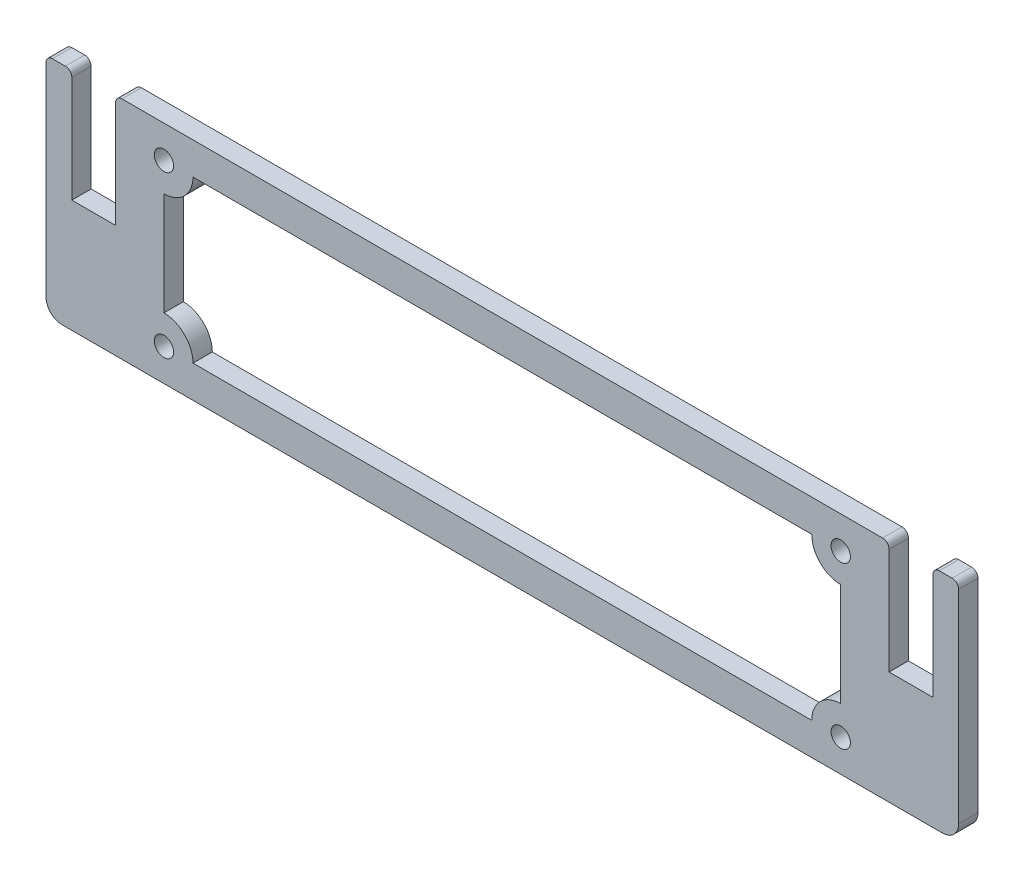
ISO-10303-21;
HEADER;
FILE_DESCRIPTION(('STEP AP214'),'2;1');
FILE_NAME('part.step','',(''),(''),'','','');
FILE_SCHEMA(('AUTOMOTIVE_DESIGN { 1 0 10303 214 1 1 1 1 }'));
ENDSEC;
DATA;
#1=APPLICATION_CONTEXT('core data for automotive mechanical design processes');
#2=APPLICATION_PROTOCOL_DEFINITION('international standard','automotive_design',2000,#1);
#3=PRODUCT_CONTEXT('',#1,'mechanical');
#4=PRODUCT('Part','Part','',(#3));
#5=PRODUCT_RELATED_PRODUCT_CATEGORY('part','',(#4));
#6=PRODUCT_DEFINITION_FORMATION('','',#4);
#7=PRODUCT_DEFINITION_CONTEXT('part definition',#1,'design');
#8=PRODUCT_DEFINITION('design','',#6,#7);
#9=PRODUCT_DEFINITION_SHAPE('','',#8);
#10=(LENGTH_UNIT() NAMED_UNIT(*) SI_UNIT(.MILLI.,.METRE.));
#11=(NAMED_UNIT(*) PLANE_ANGLE_UNIT() SI_UNIT($,.RADIAN.));
#12=(NAMED_UNIT(*) SI_UNIT($,.STERADIAN.) SOLID_ANGLE_UNIT());
#13=UNCERTAINTY_MEASURE_WITH_UNIT(LENGTH_MEASURE(1.E-05),#10,'distance_accuracy_value','');
#14=(GEOMETRIC_REPRESENTATION_CONTEXT(3) GLOBAL_UNCERTAINTY_ASSIGNED_CONTEXT((#13)) GLOBAL_UNIT_ASSIGNED_CONTEXT((#10,
#11,#12)) REPRESENTATION_CONTEXT('',''));
#15=CARTESIAN_POINT('',(0.,0.,0.));
#16=DIRECTION('',(0.,0.,1.));
#17=DIRECTION('',(1.,0.,0.));
#18=AXIS2_PLACEMENT_3D('',#15,#16,#17);
#19=CARTESIAN_POINT('',(0.,-17.5,3.));
#20=DIRECTION('',(0.,-1.,0.));
#21=DIRECTION('',(0.,0.,-1.));
#22=AXIS2_PLACEMENT_3D('',#19,#20,#21);
#23=PLANE('',#22);
#24=DIRECTION('',(-1.,0.,0.));
#25=VECTOR('',#24,1.);
#26=CARTESIAN_POINT('',(0.,-17.5,0.));
#27=LINE('',#26,#25);
#28=CARTESIAN_POINT('',(68.3,-17.5,0.));
#29=VERTEX_POINT('',#28);
#30=CARTESIAN_POINT('',(-68.3,-17.5,0.));
#31=VERTEX_POINT('',#30);
#32=EDGE_CURVE('E338',#29,#31,#27,.T.);
#33=ORIENTED_EDGE('',*,*,#32,.F.);
#34=DIRECTION('',(0.,0.,-1.));
#35=VECTOR('',#34,1.);
#36=CARTESIAN_POINT('',(68.3,-17.5,3.));
#37=LINE('',#36,#35);
#38=CARTESIAN_POINT('',(68.3,-17.5,3.));
#39=VERTEX_POINT('',#38);
#40=EDGE_CURVE('E409',#29,#39,#37,.F.);
#41=ORIENTED_EDGE('',*,*,#40,.T.);
#42=DIRECTION('',(-1.,0.,0.));
#43=VECTOR('',#42,1.);
#44=CARTESIAN_POINT('',(0.,-17.5,3.));
#45=LINE('',#44,#43);
#46=CARTESIAN_POINT('',(-68.3,-17.5,3.));
#47=VERTEX_POINT('',#46);
#48=EDGE_CURVE('E270',#39,#47,#45,.T.);
#49=ORIENTED_EDGE('',*,*,#48,.T.);
#50=DIRECTION('',(0.,0.,-1.));
#51=VECTOR('',#50,1.);
#52=CARTESIAN_POINT('',(-68.3,-17.5,3.));
#53=LINE('',#52,#51);
#54=EDGE_CURVE('E406',#47,#31,#53,.T.);
#55=ORIENTED_EDGE('',*,*,#54,.T.);
#56=EDGE_LOOP('',(#33,#41,#49,#55));
#57=FACE_BOUND('',#56,.T.);
#58=ADVANCED_FACE('F37',(#57),#23,.T.);
#59=CARTESIAN_POINT('',(70.8,0.,3.));
#60=DIRECTION('',(-1.,0.,0.));
#61=DIRECTION('',(0.,0.,1.));
#62=AXIS2_PLACEMENT_3D('',#59,#60,#61);
#63=PLANE('',#62);
#64=DIRECTION('',(0.,1.,0.));
#65=VECTOR('',#64,1.);
#66=CARTESIAN_POINT('',(70.8,0.,0.));
#67=LINE('',#66,#65);
#68=CARTESIAN_POINT('',(70.8,-15.,0.));
#69=VERTEX_POINT('',#68);
#70=CARTESIAN_POINT('',(70.8,16.5,0.));
#71=VERTEX_POINT('',#70);
#72=EDGE_CURVE('E341',#69,#71,#67,.T.);
#73=ORIENTED_EDGE('',*,*,#72,.T.);
#74=DIRECTION('',(0.,0.,-1.));
#75=VECTOR('',#74,1.);
#76=CARTESIAN_POINT('',(70.8,16.5,3.));
#77=LINE('',#76,#75);
#78=CARTESIAN_POINT('',(70.8,16.5,3.));
#79=VERTEX_POINT('',#78);
#80=EDGE_CURVE('E434',#71,#79,#77,.F.);
#81=ORIENTED_EDGE('',*,*,#80,.T.);
#82=DIRECTION('',(0.,1.,0.));
#83=VECTOR('',#82,1.);
#84=CARTESIAN_POINT('',(70.8,0.,3.));
#85=LINE('',#84,#83);
#86=CARTESIAN_POINT('',(70.8,-15.,3.));
#87=VERTEX_POINT('',#86);
#88=EDGE_CURVE('E273',#87,#79,#85,.T.);
#89=ORIENTED_EDGE('',*,*,#88,.F.);
#90=DIRECTION('',(0.,0.,-1.));
#91=VECTOR('',#90,1.);
#92=CARTESIAN_POINT('',(70.8,-15.,0.));
#93=LINE('',#92,#91);
#94=EDGE_CURVE('E385',#87,#69,#93,.T.);
#95=ORIENTED_EDGE('',*,*,#94,.T.);
#96=EDGE_LOOP('',(#73,#81,#89,#95));
#97=FACE_BOUND('',#96,.T.);
#98=ADVANCED_FACE('F501',(#97),#63,.F.);
#99=CARTESIAN_POINT('',(0.,17.5,3.));
#100=DIRECTION('',(0.,1.,0.));
#101=DIRECTION('',(0.,0.,1.));
#102=AXIS2_PLACEMENT_3D('',#99,#100,#101);
#103=PLANE('',#102);
#104=DIRECTION('',(1.,0.,0.));
#105=VECTOR('',#104,1.);
#106=CARTESIAN_POINT('',(0.,17.5,3.));
#107=LINE('',#106,#105);
#108=CARTESIAN_POINT('',(67.8,17.5,3.));
#109=VERTEX_POINT('',#108);
#110=CARTESIAN_POINT('',(69.8,17.5,3.));
#111=VERTEX_POINT('',#110);
#112=EDGE_CURVE('E276',#109,#111,#107,.T.);
#113=ORIENTED_EDGE('',*,*,#112,.T.);
#114=DIRECTION('',(0.,0.,-1.));
#115=VECTOR('',#114,1.);
#116=CARTESIAN_POINT('',(69.8,17.5,0.));
#117=LINE('',#116,#115);
#118=CARTESIAN_POINT('',(69.8,17.5,0.));
#119=VERTEX_POINT('',#118);
#120=EDGE_CURVE('E419',#111,#119,#117,.T.);
#121=ORIENTED_EDGE('',*,*,#120,.T.);
#122=DIRECTION('',(1.,0.,0.));
#123=VECTOR('',#122,1.);
#124=CARTESIAN_POINT('',(0.,17.5,0.));
#125=LINE('',#124,#123);
#126=CARTESIAN_POINT('',(67.8,17.5,0.));
#127=VERTEX_POINT('',#126);
#128=EDGE_CURVE('E344',#127,#119,#125,.T.);
#129=ORIENTED_EDGE('',*,*,#128,.F.);
#130=DIRECTION('',(0.,0.,-1.));
#131=VECTOR('',#130,1.);
#132=CARTESIAN_POINT('',(67.8,17.5,3.));
#133=LINE('',#132,#131);
#134=EDGE_CURVE('E417',#127,#109,#133,.F.);
#135=ORIENTED_EDGE('',*,*,#134,.T.);
#136=EDGE_LOOP('',(#113,#121,#129,#135));
#137=FACE_BOUND('',#136,.T.);
#138=ADVANCED_FACE('F510',(#137),#103,.T.);
#139=CARTESIAN_POINT('',(66.8,0.,3.));
#140=DIRECTION('',(-1.,0.,0.));
#141=DIRECTION('',(0.,0.,1.));
#142=AXIS2_PLACEMENT_3D('',#139,#140,#141);
#143=PLANE('',#142);
#144=DIRECTION('',(0.,1.,0.));
#145=VECTOR('',#144,1.);
#146=CARTESIAN_POINT('',(66.8,0.,3.));
#147=LINE('',#146,#145);
#148=CARTESIAN_POINT('',(66.8,0.,3.));
#149=VERTEX_POINT('',#148);
#150=CARTESIAN_POINT('',(66.8,16.5,3.));
#151=VERTEX_POINT('',#150);
#152=EDGE_CURVE('E279',#149,#151,#147,.T.);
#153=ORIENTED_EDGE('',*,*,#152,.T.);
#154=DIRECTION('',(0.,0.,-1.));
#155=VECTOR('',#154,1.);
#156=CARTESIAN_POINT('',(66.8,16.5,3.));
#157=LINE('',#156,#155);
#158=CARTESIAN_POINT('',(66.8,16.5,0.));
#159=VERTEX_POINT('',#158);
#160=EDGE_CURVE('E447',#151,#159,#157,.T.);
#161=ORIENTED_EDGE('',*,*,#160,.T.);
#162=DIRECTION('',(0.,1.,0.));
#163=VECTOR('',#162,1.);
#164=CARTESIAN_POINT('',(66.8,0.,0.));
#165=LINE('',#164,#163);
#166=CARTESIAN_POINT('',(66.8,0.,0.));
#167=VERTEX_POINT('',#166);
#168=EDGE_CURVE('E347',#167,#159,#165,.T.);
#169=ORIENTED_EDGE('',*,*,#168,.F.);
#170=DIRECTION('',(0.,0.,-1.));
#171=VECTOR('',#170,1.);
#172=CARTESIAN_POINT('',(66.8,0.,3.));
#173=LINE('',#172,#171);
#174=EDGE_CURVE('E383',#149,#167,#173,.T.);
#175=ORIENTED_EDGE('',*,*,#174,.F.);
#176=EDGE_LOOP('',(#153,#161,#169,#175));
#177=FACE_BOUND('',#176,.T.);
#178=ADVANCED_FACE('F518',(#177),#143,.T.);
#179=CARTESIAN_POINT('',(0.,0.,3.));
#180=DIRECTION('',(0.,1.,0.));
#181=DIRECTION('',(-1.,0.,0.));
#182=AXIS2_PLACEMENT_3D('',#179,#180,#181);
#183=PLANE('',#182);
#184=DIRECTION('',(1.,0.,0.));
#185=VECTOR('',#184,1.);
#186=CARTESIAN_POINT('',(0.,0.,0.));
#187=LINE('',#186,#185);
#188=CARTESIAN_POINT('',(60.,0.,0.));
#189=VERTEX_POINT('',#188);
#190=EDGE_CURVE('E350',#189,#167,#187,.T.);
#191=ORIENTED_EDGE('',*,*,#190,.F.);
#192=DIRECTION('',(0.,0.,-1.));
#193=VECTOR('',#192,1.);
#194=CARTESIAN_POINT('',(60.,0.,3.));
#195=LINE('',#194,#193);
#196=CARTESIAN_POINT('',(60.,0.,3.));
#197=VERTEX_POINT('',#196);
#198=EDGE_CURVE('E381',#197,#189,#195,.T.);
#199=ORIENTED_EDGE('',*,*,#198,.F.);
#200=DIRECTION('',(1.,0.,0.));
#201=VECTOR('',#200,1.);
#202=CARTESIAN_POINT('',(0.,0.,3.));
#203=LINE('',#202,#201);
#204=EDGE_CURVE('E282',#197,#149,#203,.T.);
#205=ORIENTED_EDGE('',*,*,#204,.T.);
#206=ORIENTED_EDGE('',*,*,#174,.T.);
#207=EDGE_LOOP('',(#191,#199,#205,#206));
#208=FACE_BOUND('',#207,.T.);
#209=ADVANCED_FACE('F523',(#208),#183,.T.);
#210=CARTESIAN_POINT('',(60.,0.,3.));
#211=DIRECTION('',(-1.,0.,0.));
#212=DIRECTION('',(0.,-1.,0.));
#213=AXIS2_PLACEMENT_3D('',#210,#211,#212);
#214=PLANE('',#213);
#215=DIRECTION('',(0.,1.,0.));
#216=VECTOR('',#215,1.);
#217=CARTESIAN_POINT('',(60.,0.,0.));
#218=LINE('',#217,#216);
#219=CARTESIAN_POINT('',(60.,16.5,0.));
#220=VERTEX_POINT('',#219);
#221=EDGE_CURVE('E353',#189,#220,#218,.T.);
#222=ORIENTED_EDGE('',*,*,#221,.T.);
#223=DIRECTION('',(0.,0.,-1.));
#224=VECTOR('',#223,1.);
#225=CARTESIAN_POINT('',(60.,16.5,3.));
#226=LINE('',#225,#224);
#227=CARTESIAN_POINT('',(60.,16.5,3.));
#228=VERTEX_POINT('',#227);
#229=EDGE_CURVE('E455',#220,#228,#226,.F.);
#230=ORIENTED_EDGE('',*,*,#229,.T.);
#231=DIRECTION('',(0.,1.,0.));
#232=VECTOR('',#231,1.);
#233=CARTESIAN_POINT('',(60.,0.,3.));
#234=LINE('',#233,#232);
#235=EDGE_CURVE('E285',#197,#228,#234,.T.);
#236=ORIENTED_EDGE('',*,*,#235,.F.);
#237=ORIENTED_EDGE('',*,*,#198,.T.);
#238=EDGE_LOOP('',(#222,#230,#236,#237));
#239=FACE_BOUND('',#238,.T.);
#240=ADVANCED_FACE('F527',(#239),#214,.F.);
#241=CARTESIAN_POINT('',(0.,17.5,3.));
#242=DIRECTION('',(0.,1.,0.));
#243=DIRECTION('',(-1.,0.,0.));
#244=AXIS2_PLACEMENT_3D('',#241,#242,#243);
#245=PLANE('',#244);
#246=DIRECTION('',(1.,0.,0.));
#247=VECTOR('',#246,1.);
#248=CARTESIAN_POINT('',(0.,17.5,3.));
#249=LINE('',#248,#247);
#250=CARTESIAN_POINT('',(-59.,17.5,3.));
#251=VERTEX_POINT('',#250);
#252=CARTESIAN_POINT('',(59.,17.5,3.));
#253=VERTEX_POINT('',#252);
#254=EDGE_CURVE('E288',#251,#253,#249,.T.);
#255=ORIENTED_EDGE('',*,*,#254,.T.);
#256=DIRECTION('',(0.,0.,-1.));
#257=VECTOR('',#256,1.);
#258=CARTESIAN_POINT('',(59.,17.5,0.));
#259=LINE('',#258,#257);
#260=CARTESIAN_POINT('',(59.,17.5,0.));
#261=VERTEX_POINT('',#260);
#262=EDGE_CURVE('E452',#253,#261,#259,.T.);
#263=ORIENTED_EDGE('',*,*,#262,.T.);
#264=DIRECTION('',(1.,0.,0.));
#265=VECTOR('',#264,1.);
#266=CARTESIAN_POINT('',(0.,17.5,0.));
#267=LINE('',#266,#265);
#268=CARTESIAN_POINT('',(-59.,17.5,0.));
#269=VERTEX_POINT('',#268);
#270=EDGE_CURVE('E356',#269,#261,#267,.T.);
#271=ORIENTED_EDGE('',*,*,#270,.F.);
#272=DIRECTION('',(0.,0.,-1.));
#273=VECTOR('',#272,1.);
#274=CARTESIAN_POINT('',(-59.,17.5,3.));
#275=LINE('',#274,#273);
#276=EDGE_CURVE('E450',#269,#251,#275,.F.);
#277=ORIENTED_EDGE('',*,*,#276,.T.);
#278=EDGE_LOOP('',(#255,#263,#271,#277));
#279=FACE_BOUND('',#278,.T.);
#280=ADVANCED_FACE('F536',(#279),#245,.T.);
#281=CARTESIAN_POINT('',(-60.,0.,3.));
#282=DIRECTION('',(-1.,0.,0.));
#283=DIRECTION('',(0.,0.,1.));
#284=AXIS2_PLACEMENT_3D('',#281,#282,#283);
#285=PLANE('',#284);
#286=DIRECTION('',(0.,1.,0.));
#287=VECTOR('',#286,1.);
#288=CARTESIAN_POINT('',(-60.,0.,3.));
#289=LINE('',#288,#287);
#290=CARTESIAN_POINT('',(-60.,0.,3.));
#291=VERTEX_POINT('',#290);
#292=CARTESIAN_POINT('',(-60.,16.5,3.));
#293=VERTEX_POINT('',#292);
#294=EDGE_CURVE('E291',#291,#293,#289,.T.);
#295=ORIENTED_EDGE('',*,*,#294,.T.);
#296=DIRECTION('',(0.,0.,-1.));
#297=VECTOR('',#296,1.);
#298=CARTESIAN_POINT('',(-60.,16.5,3.));
#299=LINE('',#298,#297);
#300=CARTESIAN_POINT('',(-60.,16.5,0.));
#301=VERTEX_POINT('',#300);
#302=EDGE_CURVE('E11',#293,#301,#299,.T.);
#303=ORIENTED_EDGE('',*,*,#302,.T.);
#304=DIRECTION('',(0.,1.,0.));
#305=VECTOR('',#304,1.);
#306=CARTESIAN_POINT('',(-60.,0.,0.));
#307=LINE('',#306,#305);
#308=CARTESIAN_POINT('',(-60.,0.,0.));
#309=VERTEX_POINT('',#308);
#310=EDGE_CURVE('E359',#309,#301,#307,.T.);
#311=ORIENTED_EDGE('',*,*,#310,.F.);
#312=DIRECTION('',(0.,0.,-1.));
#313=VECTOR('',#312,1.);
#314=CARTESIAN_POINT('',(-60.,0.,3.));
#315=LINE('',#314,#313);
#316=EDGE_CURVE('E379',#291,#309,#315,.T.);
#317=ORIENTED_EDGE('',*,*,#316,.F.);
#318=EDGE_LOOP('',(#295,#303,#311,#317));
#319=FACE_BOUND('',#318,.T.);
#320=ADVANCED_FACE('F544',(#319),#285,.T.);
#321=CARTESIAN_POINT('',(0.,0.,3.));
#322=DIRECTION('',(0.,-1.,0.));
#323=DIRECTION('',(1.,0.,0.));
#324=AXIS2_PLACEMENT_3D('',#321,#322,#323);
#325=PLANE('',#324);
#326=DIRECTION('',(-1.,0.,0.));
#327=VECTOR('',#326,1.);
#328=CARTESIAN_POINT('',(0.,0.,0.));
#329=LINE('',#328,#327);
#330=CARTESIAN_POINT('',(-66.8,0.,0.));
#331=VERTEX_POINT('',#330);
#332=EDGE_CURVE('E362',#309,#331,#329,.T.);
#333=ORIENTED_EDGE('',*,*,#332,.T.);
#334=DIRECTION('',(0.,0.,-1.));
#335=VECTOR('',#334,1.);
#336=CARTESIAN_POINT('',(-66.8,0.,3.));
#337=LINE('',#336,#335);
#338=CARTESIAN_POINT('',(-66.8,0.,3.));
#339=VERTEX_POINT('',#338);
#340=EDGE_CURVE('E235',#339,#331,#337,.T.);
#341=ORIENTED_EDGE('',*,*,#340,.F.);
#342=DIRECTION('',(-1.,0.,0.));
#343=VECTOR('',#342,1.);
#344=CARTESIAN_POINT('',(0.,0.,3.));
#345=LINE('',#344,#343);
#346=EDGE_CURVE('E294',#291,#339,#345,.T.);
#347=ORIENTED_EDGE('',*,*,#346,.F.);
#348=ORIENTED_EDGE('',*,*,#316,.T.);
#349=EDGE_LOOP('',(#333,#341,#347,#348));
#350=FACE_BOUND('',#349,.T.);
#351=ADVANCED_FACE('F546',(#350),#325,.F.);
#352=CARTESIAN_POINT('',(-66.8,0.,3.));
#353=DIRECTION('',(-1.,0.,0.));
#354=DIRECTION('',(0.,0.,1.));
#355=AXIS2_PLACEMENT_3D('',#352,#353,#354);
#356=PLANE('',#355);
#357=DIRECTION('',(0.,1.,0.));
#358=VECTOR('',#357,1.);
#359=CARTESIAN_POINT('',(-66.8,0.,0.));
#360=LINE('',#359,#358);
#361=CARTESIAN_POINT('',(-66.8,16.5,0.));
#362=VERTEX_POINT('',#361);
#363=EDGE_CURVE('E365',#331,#362,#360,.T.);
#364=ORIENTED_EDGE('',*,*,#363,.T.);
#365=DIRECTION('',(0.,0.,-1.));
#366=VECTOR('',#365,1.);
#367=CARTESIAN_POINT('',(-66.8,16.5,3.));
#368=LINE('',#367,#366);
#369=CARTESIAN_POINT('',(-66.8,16.5,3.));
#370=VERTEX_POINT('',#369);
#371=EDGE_CURVE('E45',#362,#370,#368,.F.);
#372=ORIENTED_EDGE('',*,*,#371,.T.);
#373=DIRECTION('',(0.,1.,0.));
#374=VECTOR('',#373,1.);
#375=CARTESIAN_POINT('',(-66.8,0.,3.));
#376=LINE('',#375,#374);
#377=EDGE_CURVE('E297',#339,#370,#376,.T.);
#378=ORIENTED_EDGE('',*,*,#377,.F.);
#379=ORIENTED_EDGE('',*,*,#340,.T.);
#380=EDGE_LOOP('',(#364,#372,#378,#379));
#381=FACE_BOUND('',#380,.T.);
#382=ADVANCED_FACE('F465',(#381),#356,.F.);
#383=CARTESIAN_POINT('',(0.,17.5,3.));
#384=DIRECTION('',(0.,-1.,0.));
#385=DIRECTION('',(0.,0.,-1.));
#386=AXIS2_PLACEMENT_3D('',#383,#384,#385);
#387=PLANE('',#386);
#388=DIRECTION('',(-1.,0.,0.));
#389=VECTOR('',#388,1.);
#390=CARTESIAN_POINT('',(0.,17.5,0.));
#391=LINE('',#390,#389);
#392=CARTESIAN_POINT('',(-67.8,17.5,0.));
#393=VERTEX_POINT('',#392);
#394=CARTESIAN_POINT('',(-69.8,17.5,0.));
#395=VERTEX_POINT('',#394);
#396=EDGE_CURVE('E368',#393,#395,#391,.T.);
#397=ORIENTED_EDGE('',*,*,#396,.T.);
#398=DIRECTION('',(0.,0.,-1.));
#399=VECTOR('',#398,1.);
#400=CARTESIAN_POINT('',(-69.8,17.5,3.));
#401=LINE('',#400,#399);
#402=CARTESIAN_POINT('',(-69.8,17.5,3.));
#403=VERTEX_POINT('',#402);
#404=EDGE_CURVE('E60',#395,#403,#401,.F.);
#405=ORIENTED_EDGE('',*,*,#404,.T.);
#406=DIRECTION('',(-1.,0.,0.));
#407=VECTOR('',#406,1.);
#408=CARTESIAN_POINT('',(0.,17.5,3.));
#409=LINE('',#408,#407);
#410=CARTESIAN_POINT('',(-67.8,17.5,3.));
#411=VERTEX_POINT('',#410);
#412=EDGE_CURVE('E300',#411,#403,#409,.T.);
#413=ORIENTED_EDGE('',*,*,#412,.F.);
#414=DIRECTION('',(0.,0.,-1.));
#415=VECTOR('',#414,1.);
#416=CARTESIAN_POINT('',(-67.8,17.5,3.));
#417=LINE('',#416,#415);
#418=EDGE_CURVE('E460',#411,#393,#417,.T.);
#419=ORIENTED_EDGE('',*,*,#418,.T.);
#420=EDGE_LOOP('',(#397,#405,#413,#419));
#421=FACE_BOUND('',#420,.T.);
#422=ADVANCED_FACE('F475',(#421),#387,.F.);
#423=CARTESIAN_POINT('',(52.5,0.,3.));
#424=DIRECTION('',(-1.,0.,0.));
#425=DIRECTION('',(0.,0.,1.));
#426=AXIS2_PLACEMENT_3D('',#423,#424,#425);
#427=PLANE('',#426);
#428=DIRECTION('',(0.,1.,0.));
#429=VECTOR('',#428,1.);
#430=CARTESIAN_POINT('',(52.5,0.,0.));
#431=LINE('',#430,#429);
#432=CARTESIAN_POINT('',(52.5,-8.,0.));
#433=VERTEX_POINT('',#432);
#434=CARTESIAN_POINT('',(52.5,8.,0.));
#435=VERTEX_POINT('',#434);
#436=EDGE_CURVE('E230',#433,#435,#431,.T.);
#437=ORIENTED_EDGE('',*,*,#436,.F.);
#438=DIRECTION('',(0.,0.,-1.));
#439=VECTOR('',#438,1.);
#440=CARTESIAN_POINT('',(52.5,-8.,3.));
#441=LINE('',#440,#439);
#442=CARTESIAN_POINT('',(52.5,-8.,3.));
#443=VERTEX_POINT('',#442);
#444=EDGE_CURVE('E225',#443,#433,#441,.T.);
#445=ORIENTED_EDGE('',*,*,#444,.F.);
#446=DIRECTION('',(0.,1.,0.));
#447=VECTOR('',#446,1.);
#448=CARTESIAN_POINT('',(52.5,0.,3.));
#449=LINE('',#448,#447);
#450=CARTESIAN_POINT('',(52.5,8.,3.));
#451=VERTEX_POINT('',#450);
#452=EDGE_CURVE('E228',#443,#451,#449,.T.);
#453=ORIENTED_EDGE('',*,*,#452,.T.);
#454=DIRECTION('',(0.,0.,-1.));
#455=VECTOR('',#454,1.);
#456=CARTESIAN_POINT('',(52.5,8.,3.));
#457=LINE('',#456,#455);
#458=EDGE_CURVE('E307',#451,#435,#457,.T.);
#459=ORIENTED_EDGE('',*,*,#458,.T.);
#460=EDGE_LOOP('',(#437,#445,#453,#459));
#461=FACE_BOUND('',#460,.T.);
#462=ADVANCED_FACE('F227',(#461),#427,.T.);
#463=CARTESIAN_POINT('',(52.5,-12.5,3.));
#464=DIRECTION('',(0.,0.,-1.));
#465=DIRECTION('',(-1.,0.,0.));
#466=AXIS2_PLACEMENT_3D('',#463,#464,#465);
#467=CYLINDRICAL_SURFACE('',#466,4.5);
#468=CARTESIAN_POINT('',(52.5,-12.5,0.));
#469=DIRECTION('',(0.,0.,1.));
#470=DIRECTION('',(1.,0.,0.));
#471=AXIS2_PLACEMENT_3D('',#468,#469,#470);
#472=CIRCLE('',#471,4.5);
#473=CARTESIAN_POINT('',(48.,-12.5,0.));
#474=VERTEX_POINT('',#473);
#475=EDGE_CURVE('E315',#474,#433,#472,.F.);
#476=ORIENTED_EDGE('',*,*,#475,.F.);
#477=DIRECTION('',(0.,0.,-1.));
#478=VECTOR('',#477,1.);
#479=CARTESIAN_POINT('',(48.,-12.5,3.));
#480=LINE('',#479,#478);
#481=CARTESIAN_POINT('',(48.,-12.5,3.));
#482=VERTEX_POINT('',#481);
#483=EDGE_CURVE('E236',#482,#474,#480,.T.);
#484=ORIENTED_EDGE('',*,*,#483,.F.);
#485=CARTESIAN_POINT('',(52.5,-12.5,3.));
#486=DIRECTION('',(0.,0.,1.));
#487=DIRECTION('',(1.,0.,0.));
#488=AXIS2_PLACEMENT_3D('',#485,#486,#487);
#489=CIRCLE('',#488,4.5);
#490=EDGE_CURVE('E243',#482,#443,#489,.F.);
#491=ORIENTED_EDGE('',*,*,#490,.T.);
#492=ORIENTED_EDGE('',*,*,#444,.T.);
#493=EDGE_LOOP('',(#476,#484,#491,#492));
#494=FACE_BOUND('',#493,.T.);
#495=ADVANCED_FACE('F250',(#494),#467,.T.);
#496=CARTESIAN_POINT('',(0.,-12.5,3.));
#497=DIRECTION('',(0.,1.,0.));
#498=DIRECTION('',(0.,0.,1.));
#499=AXIS2_PLACEMENT_3D('',#496,#497,#498);
#500=PLANE('',#499);
#501=DIRECTION('',(1.,0.,0.));
#502=VECTOR('',#501,1.);
#503=CARTESIAN_POINT('',(0.,-12.5,0.));
#504=LINE('',#503,#502);
#505=CARTESIAN_POINT('',(-48.,-12.5,0.));
#506=VERTEX_POINT('',#505);
#507=EDGE_CURVE('E317',#506,#474,#504,.T.);
#508=ORIENTED_EDGE('',*,*,#507,.F.);
#509=DIRECTION('',(0.,0.,-1.));
#510=VECTOR('',#509,1.);
#511=CARTESIAN_POINT('',(-48.,-12.5,3.));
#512=LINE('',#511,#510);
#513=CARTESIAN_POINT('',(-48.,-12.5,3.));
#514=VERTEX_POINT('',#513);
#515=EDGE_CURVE('E397',#514,#506,#512,.T.);
#516=ORIENTED_EDGE('',*,*,#515,.F.);
#517=DIRECTION('',(1.,0.,0.));
#518=VECTOR('',#517,1.);
#519=CARTESIAN_POINT('',(0.,-12.5,3.));
#520=LINE('',#519,#518);
#521=EDGE_CURVE('E251',#514,#482,#520,.T.);
#522=ORIENTED_EDGE('',*,*,#521,.T.);
#523=ORIENTED_EDGE('',*,*,#483,.T.);
#524=EDGE_LOOP('',(#508,#516,#522,#523));
#525=FACE_BOUND('',#524,.T.);
#526=ADVANCED_FACE('F587',(#525),#500,.T.);
#527=CARTESIAN_POINT('',(-52.5,-12.5,3.));
#528=DIRECTION('',(0.,0.,-1.));
#529=DIRECTION('',(-1.,0.,0.));
#530=AXIS2_PLACEMENT_3D('',#527,#528,#529);
#531=CYLINDRICAL_SURFACE('',#530,4.49999999999998);
#532=CARTESIAN_POINT('',(-52.5,-12.5,0.));
#533=DIRECTION('',(0.,0.,1.));
#534=DIRECTION('',(1.,0.,0.));
#535=AXIS2_PLACEMENT_3D('',#532,#533,#534);
#536=CIRCLE('',#535,4.49999999999998);
#537=CARTESIAN_POINT('',(-52.5,-8.00000000000002,0.));
#538=VERTEX_POINT('',#537);
#539=EDGE_CURVE('E320',#506,#538,#536,.T.);
#540=ORIENTED_EDGE('',*,*,#539,.T.);
#541=DIRECTION('',(0.,0.,-1.));
#542=VECTOR('',#541,1.);
#543=CARTESIAN_POINT('',(-52.5,-8.00000000000002,3.));
#544=LINE('',#543,#542);
#545=CARTESIAN_POINT('',(-52.5,-8.00000000000002,3.));
#546=VERTEX_POINT('',#545);
#547=EDGE_CURVE('E394',#546,#538,#544,.T.);
#548=ORIENTED_EDGE('',*,*,#547,.F.);
#549=CARTESIAN_POINT('',(-52.5,-12.5,3.));
#550=DIRECTION('',(0.,0.,1.));
#551=DIRECTION('',(1.,0.,0.));
#552=AXIS2_PLACEMENT_3D('',#549,#550,#551);
#553=CIRCLE('',#552,4.49999999999998);
#554=EDGE_CURVE('E253',#514,#546,#553,.T.);
#555=ORIENTED_EDGE('',*,*,#554,.F.);
#556=ORIENTED_EDGE('',*,*,#515,.T.);
#557=EDGE_LOOP('',(#540,#548,#555,#556));
#558=FACE_BOUND('',#557,.T.);
#559=ADVANCED_FACE('F583',(#558),#531,.T.);
#560=CARTESIAN_POINT('',(-52.5,0.,3.));
#561=DIRECTION('',(-1.,0.,0.));
#562=DIRECTION('',(0.,0.,1.));
#563=AXIS2_PLACEMENT_3D('',#560,#561,#562);
#564=PLANE('',#563);
#565=DIRECTION('',(0.,1.,0.));
#566=VECTOR('',#565,1.);
#567=CARTESIAN_POINT('',(-52.5,0.,0.));
#568=LINE('',#567,#566);
#569=CARTESIAN_POINT('',(-52.5,8.,0.));
#570=VERTEX_POINT('',#569);
#571=EDGE_CURVE('E323',#538,#570,#568,.T.);
#572=ORIENTED_EDGE('',*,*,#571,.T.);
#573=DIRECTION('',(0.,0.,-1.));
#574=VECTOR('',#573,1.);
#575=CARTESIAN_POINT('',(-52.5,8.,3.));
#576=LINE('',#575,#574);
#577=CARTESIAN_POINT('',(-52.5,8.,3.));
#578=VERTEX_POINT('',#577);
#579=EDGE_CURVE('E392',#578,#570,#576,.T.);
#580=ORIENTED_EDGE('',*,*,#579,.F.);
#581=DIRECTION('',(0.,1.,0.));
#582=VECTOR('',#581,1.);
#583=CARTESIAN_POINT('',(-52.5,0.,3.));
#584=LINE('',#583,#582);
#585=EDGE_CURVE('E259',#546,#578,#584,.T.);
#586=ORIENTED_EDGE('',*,*,#585,.F.);
#587=ORIENTED_EDGE('',*,*,#547,.T.);
#588=EDGE_LOOP('',(#572,#580,#586,#587));
#589=FACE_BOUND('',#588,.T.);
#590=ADVANCED_FACE('F579',(#589),#564,.F.);
#591=CARTESIAN_POINT('',(-52.5,12.5,3.));
#592=DIRECTION('',(0.,0.,-1.));
#593=DIRECTION('',(-1.,0.,0.));
#594=AXIS2_PLACEMENT_3D('',#591,#592,#593);
#595=CYLINDRICAL_SURFACE('',#594,4.5);
#596=CARTESIAN_POINT('',(-52.5,12.5,0.));
#597=DIRECTION('',(0.,0.,1.));
#598=DIRECTION('',(1.,0.,0.));
#599=AXIS2_PLACEMENT_3D('',#596,#597,#598);
#600=CIRCLE('',#599,4.5);
#601=CARTESIAN_POINT('',(-48.,12.5,0.));
#602=VERTEX_POINT('',#601);
#603=EDGE_CURVE('E326',#602,#570,#600,.F.);
#604=ORIENTED_EDGE('',*,*,#603,.F.);
#605=DIRECTION('',(0.,0.,-1.));
#606=VECTOR('',#605,1.);
#607=CARTESIAN_POINT('',(-48.,12.5,3.));
#608=LINE('',#607,#606);
#609=CARTESIAN_POINT('',(-48.,12.5,3.));
#610=VERTEX_POINT('',#609);
#611=EDGE_CURVE('E390',#610,#602,#608,.T.);
#612=ORIENTED_EDGE('',*,*,#611,.F.);
#613=CARTESIAN_POINT('',(-52.5,12.5,3.));
#614=DIRECTION('',(0.,0.,1.));
#615=DIRECTION('',(1.,0.,0.));
#616=AXIS2_PLACEMENT_3D('',#613,#614,#615);
#617=CIRCLE('',#616,4.5);
#618=EDGE_CURVE('E261',#610,#578,#617,.F.);
#619=ORIENTED_EDGE('',*,*,#618,.T.);
#620=ORIENTED_EDGE('',*,*,#579,.T.);
#621=EDGE_LOOP('',(#604,#612,#619,#620));
#622=FACE_BOUND('',#621,.T.);
#623=ADVANCED_FACE('F575',(#622),#595,.T.);
#624=CARTESIAN_POINT('',(0.,12.5,3.));
#625=DIRECTION('',(0.,1.,0.));
#626=DIRECTION('',(-1.,0.,0.));
#627=AXIS2_PLACEMENT_3D('',#624,#625,#626);
#628=PLANE('',#627);
#629=DIRECTION('',(1.,0.,0.));
#630=VECTOR('',#629,1.);
#631=CARTESIAN_POINT('',(0.,12.5,0.));
#632=LINE('',#631,#630);
#633=CARTESIAN_POINT('',(48.,12.5,0.));
#634=VERTEX_POINT('',#633);
#635=EDGE_CURVE('E329',#602,#634,#632,.T.);
#636=ORIENTED_EDGE('',*,*,#635,.T.);
#637=DIRECTION('',(0.,0.,-1.));
#638=VECTOR('',#637,1.);
#639=CARTESIAN_POINT('',(48.,12.5,3.));
#640=LINE('',#639,#638);
#641=CARTESIAN_POINT('',(48.,12.5,3.));
#642=VERTEX_POINT('',#641);
#643=EDGE_CURVE('E387',#642,#634,#640,.T.);
#644=ORIENTED_EDGE('',*,*,#643,.F.);
#645=DIRECTION('',(1.,0.,0.));
#646=VECTOR('',#645,1.);
#647=CARTESIAN_POINT('',(0.,12.5,3.));
#648=LINE('',#647,#646);
#649=EDGE_CURVE('E264',#610,#642,#648,.T.);
#650=ORIENTED_EDGE('',*,*,#649,.F.);
#651=ORIENTED_EDGE('',*,*,#611,.T.);
#652=EDGE_LOOP('',(#636,#644,#650,#651));
#653=FACE_BOUND('',#652,.T.);
#654=ADVANCED_FACE('F572',(#653),#628,.F.);
#655=CARTESIAN_POINT('',(-70.8,0.,3.));
#656=DIRECTION('',(-1.,0.,0.));
#657=DIRECTION('',(0.,0.,1.));
#658=AXIS2_PLACEMENT_3D('',#655,#656,#657);
#659=PLANE('',#658);
#660=DIRECTION('',(0.,1.,0.));
#661=VECTOR('',#660,1.);
#662=CARTESIAN_POINT('',(-70.8,0.,3.));
#663=LINE('',#662,#661);
#664=CARTESIAN_POINT('',(-70.8,-15.,3.));
#665=VERTEX_POINT('',#664);
#666=CARTESIAN_POINT('',(-70.8,16.5,3.));
#667=VERTEX_POINT('',#666);
#668=EDGE_CURVE('E302',#665,#667,#663,.T.);
#669=ORIENTED_EDGE('',*,*,#668,.T.);
#670=DIRECTION('',(0.,0.,-1.));
#671=VECTOR('',#670,1.);
#672=CARTESIAN_POINT('',(-70.8,16.5,0.));
#673=LINE('',#672,#671);
#674=CARTESIAN_POINT('',(-70.8,16.5,0.));
#675=VERTEX_POINT('',#674);
#676=EDGE_CURVE('E457',#667,#675,#673,.T.);
#677=ORIENTED_EDGE('',*,*,#676,.T.);
#678=DIRECTION('',(0.,1.,0.));
#679=VECTOR('',#678,1.);
#680=CARTESIAN_POINT('',(-70.8,0.,0.));
#681=LINE('',#680,#679);
#682=CARTESIAN_POINT('',(-70.8,-15.,0.));
#683=VERTEX_POINT('',#682);
#684=EDGE_CURVE('E370',#683,#675,#681,.T.);
#685=ORIENTED_EDGE('',*,*,#684,.F.);
#686=DIRECTION('',(0.,0.,-1.));
#687=VECTOR('',#686,1.);
#688=CARTESIAN_POINT('',(-70.8,-15.,3.));
#689=LINE('',#688,#687);
#690=EDGE_CURVE('E415',#683,#665,#689,.F.);
#691=ORIENTED_EDGE('',*,*,#690,.T.);
#692=EDGE_LOOP('',(#669,#677,#685,#691));
#693=FACE_BOUND('',#692,.T.);
#694=ADVANCED_FACE('F484',(#693),#659,.T.);
#695=CARTESIAN_POINT('',(52.5,-12.5,3.));
#696=DIRECTION('',(0.,0.,-1.));
#697=DIRECTION('',(-1.,0.,0.));
#698=AXIS2_PLACEMENT_3D('',#695,#696,#697);
#699=CYLINDRICAL_SURFACE('',#698,1.5);
#700=CARTESIAN_POINT('',(52.5,-12.5,3.));
#701=DIRECTION('',(0.,0.,1.));
#702=DIRECTION('',(1.,0.,0.));
#703=AXIS2_PLACEMENT_3D('',#700,#701,#702);
#704=CIRCLE('',#703,1.5);
#705=CARTESIAN_POINT('',(54.,-12.5,3.));
#706=VERTEX_POINT('',#705);
#707=EDGE_CURVE('E267',#706,#706,#704,.F.);
#708=ORIENTED_EDGE('',*,*,#707,.F.);
#709=EDGE_LOOP('',(#708));
#710=FACE_BOUND('',#709,.T.);
#711=CARTESIAN_POINT('',(52.5,-12.5,0.));
#712=DIRECTION('',(0.,0.,1.));
#713=DIRECTION('',(1.,0.,0.));
#714=AXIS2_PLACEMENT_3D('',#711,#712,#713);
#715=CIRCLE('',#714,1.5);
#716=CARTESIAN_POINT('',(54.,-12.5,0.));
#717=VERTEX_POINT('',#716);
#718=EDGE_CURVE('E335',#717,#717,#715,.F.);
#719=ORIENTED_EDGE('',*,*,#718,.T.);
#720=EDGE_LOOP('',(#719));
#721=FACE_BOUND('',#720,.T.);
#722=ADVANCED_FACE('F563',(#710,#721),#699,.F.);
#723=CARTESIAN_POINT('',(52.5,12.5,3.));
#724=DIRECTION('',(0.,0.,-1.));
#725=DIRECTION('',(-1.,0.,0.));
#726=AXIS2_PLACEMENT_3D('',#723,#724,#725);
#727=CYLINDRICAL_SURFACE('',#726,4.5);
#728=CARTESIAN_POINT('',(52.5,12.5,0.));
#729=DIRECTION('',(0.,0.,1.));
#730=DIRECTION('',(1.,0.,0.));
#731=AXIS2_PLACEMENT_3D('',#728,#729,#730);
#732=CIRCLE('',#731,4.5);
#733=EDGE_CURVE('E332',#634,#435,#732,.T.);
#734=ORIENTED_EDGE('',*,*,#733,.T.);
#735=ORIENTED_EDGE('',*,*,#458,.F.);
#736=CARTESIAN_POINT('',(52.5,12.5,3.));
#737=DIRECTION('',(0.,0.,1.));
#738=DIRECTION('',(1.,0.,0.));
#739=AXIS2_PLACEMENT_3D('',#736,#737,#738);
#740=CIRCLE('',#739,4.5);
#741=EDGE_CURVE('E246',#642,#451,#740,.T.);
#742=ORIENTED_EDGE('',*,*,#741,.F.);
#743=ORIENTED_EDGE('',*,*,#643,.T.);
#744=EDGE_LOOP('',(#734,#735,#742,#743));
#745=FACE_BOUND('',#744,.T.);
#746=ADVANCED_FACE('F566',(#745),#727,.T.);
#747=CARTESIAN_POINT('',(52.5,12.5,3.));
#748=DIRECTION('',(0.,0.,-1.));
#749=DIRECTION('',(-1.,0.,0.));
#750=AXIS2_PLACEMENT_3D('',#747,#748,#749);
#751=CYLINDRICAL_SURFACE('',#750,1.5);
#752=CARTESIAN_POINT('',(52.5,12.5,3.));
#753=DIRECTION('',(0.,0.,1.));
#754=DIRECTION('',(1.,0.,0.));
#755=AXIS2_PLACEMENT_3D('',#752,#753,#754);
#756=CIRCLE('',#755,1.5);
#757=CARTESIAN_POINT('',(54.,12.5,3.));
#758=VERTEX_POINT('',#757);
#759=EDGE_CURVE('E248',#758,#758,#756,.T.);
#760=ORIENTED_EDGE('',*,*,#759,.T.);
#761=EDGE_LOOP('',(#760));
#762=FACE_BOUND('',#761,.T.);
#763=CARTESIAN_POINT('',(52.5,12.5,0.));
#764=DIRECTION('',(0.,0.,1.));
#765=DIRECTION('',(1.,0.,0.));
#766=AXIS2_PLACEMENT_3D('',#763,#764,#765);
#767=CIRCLE('',#766,1.5);
#768=CARTESIAN_POINT('',(54.,12.5,0.));
#769=VERTEX_POINT('',#768);
#770=EDGE_CURVE('E311',#769,#769,#767,.T.);
#771=ORIENTED_EDGE('',*,*,#770,.F.);
#772=EDGE_LOOP('',(#771));
#773=FACE_BOUND('',#772,.T.);
#774=ADVANCED_FACE('F570',(#762,#773),#751,.F.);
#775=CARTESIAN_POINT('',(-52.5,12.5,3.));
#776=DIRECTION('',(0.,0.,-1.));
#777=DIRECTION('',(-1.,0.,0.));
#778=AXIS2_PLACEMENT_3D('',#775,#776,#777);
#779=CYLINDRICAL_SURFACE('',#778,1.5);
#780=CARTESIAN_POINT('',(-52.5,12.5,3.));
#781=DIRECTION('',(0.,0.,1.));
#782=DIRECTION('',(1.,0.,0.));
#783=AXIS2_PLACEMENT_3D('',#780,#781,#782);
#784=CIRCLE('',#783,1.5);
#785=CARTESIAN_POINT('',(-51.,12.5,3.));
#786=VERTEX_POINT('',#785);
#787=EDGE_CURVE('E376',#786,#786,#784,.F.);
#788=ORIENTED_EDGE('',*,*,#787,.F.);
#789=EDGE_LOOP('',(#788));
#790=FACE_BOUND('',#789,.T.);
#791=CARTESIAN_POINT('',(-52.5,12.5,0.));
#792=DIRECTION('',(0.,0.,1.));
#793=DIRECTION('',(1.,0.,0.));
#794=AXIS2_PLACEMENT_3D('',#791,#792,#793);
#795=CIRCLE('',#794,1.5);
#796=CARTESIAN_POINT('',(-51.,12.5,0.));
#797=VERTEX_POINT('',#796);
#798=EDGE_CURVE('E308',#797,#797,#795,.F.);
#799=ORIENTED_EDGE('',*,*,#798,.T.);
#800=EDGE_LOOP('',(#799));
#801=FACE_BOUND('',#800,.T.);
#802=ADVANCED_FACE('F598',(#790,#801),#779,.F.);
#803=CARTESIAN_POINT('',(-52.5,-12.5,3.));
#804=DIRECTION('',(0.,0.,-1.));
#805=DIRECTION('',(-1.,0.,0.));
#806=AXIS2_PLACEMENT_3D('',#803,#804,#805);
#807=CYLINDRICAL_SURFACE('',#806,1.49999999999998);
#808=CARTESIAN_POINT('',(-52.5,-12.5,3.));
#809=DIRECTION('',(0.,0.,1.));
#810=DIRECTION('',(1.,0.,0.));
#811=AXIS2_PLACEMENT_3D('',#808,#809,#810);
#812=CIRCLE('',#811,1.49999999999998);
#813=CARTESIAN_POINT('',(-51.,-12.5,3.));
#814=VERTEX_POINT('',#813);
#815=EDGE_CURVE('E304',#814,#814,#812,.T.);
#816=ORIENTED_EDGE('',*,*,#815,.T.);
#817=EDGE_LOOP('',(#816));
#818=FACE_BOUND('',#817,.T.);
#819=CARTESIAN_POINT('',(-52.5,-12.5,0.));
#820=DIRECTION('',(0.,0.,1.));
#821=DIRECTION('',(1.,0.,0.));
#822=AXIS2_PLACEMENT_3D('',#819,#820,#821);
#823=CIRCLE('',#822,1.49999999999998);
#824=CARTESIAN_POINT('',(-51.,-12.5,0.));
#825=VERTEX_POINT('',#824);
#826=EDGE_CURVE('E373',#825,#825,#823,.T.);
#827=ORIENTED_EDGE('',*,*,#826,.F.);
#828=EDGE_LOOP('',(#827));
#829=FACE_BOUND('',#828,.T.);
#830=ADVANCED_FACE('F602',(#818,#829),#807,.F.);
#831=CARTESIAN_POINT('',(0.,0.,3.));
#832=DIRECTION('',(0.,0.,1.));
#833=DIRECTION('',(1.,0.,0.));
#834=AXIS2_PLACEMENT_3D('',#831,#832,#833);
#835=PLANE('',#834);
#836=ORIENTED_EDGE('',*,*,#787,.T.);
#837=EDGE_LOOP('',(#836));
#838=FACE_BOUND('',#837,.T.);
#839=ORIENTED_EDGE('',*,*,#759,.F.);
#840=EDGE_LOOP('',(#839));
#841=FACE_BOUND('',#840,.T.);
#842=ORIENTED_EDGE('',*,*,#452,.F.);
#843=ORIENTED_EDGE('',*,*,#490,.F.);
#844=ORIENTED_EDGE('',*,*,#521,.F.);
#845=ORIENTED_EDGE('',*,*,#554,.T.);
#846=ORIENTED_EDGE('',*,*,#585,.T.);
#847=ORIENTED_EDGE('',*,*,#618,.F.);
#848=ORIENTED_EDGE('',*,*,#649,.T.);
#849=ORIENTED_EDGE('',*,*,#741,.T.);
#850=EDGE_LOOP('',(#842,#843,#844,#845,#846,#847,#848,#849));
#851=FACE_BOUND('',#850,.T.);
#852=ORIENTED_EDGE('',*,*,#707,.T.);
#853=EDGE_LOOP('',(#852));
#854=FACE_BOUND('',#853,.T.);
#855=ORIENTED_EDGE('',*,*,#88,.T.);
#856=CARTESIAN_POINT('',(69.8,16.5,3.));
#857=DIRECTION('',(0.,0.,1.));
#858=DIRECTION('',(1.,0.,0.));
#859=AXIS2_PLACEMENT_3D('',#856,#857,#858);
#860=CIRCLE('',#859,1.);
#861=EDGE_CURVE('E445',#79,#111,#860,.T.);
#862=ORIENTED_EDGE('',*,*,#861,.T.);
#863=ORIENTED_EDGE('',*,*,#112,.F.);
#864=CARTESIAN_POINT('',(67.8,16.5,3.));
#865=DIRECTION('',(0.,0.,1.));
#866=DIRECTION('',(1.,0.,0.));
#867=AXIS2_PLACEMENT_3D('',#864,#865,#866);
#868=CIRCLE('',#867,1.);
#869=EDGE_CURVE('E443',#109,#151,#868,.T.);
#870=ORIENTED_EDGE('',*,*,#869,.T.);
#871=ORIENTED_EDGE('',*,*,#152,.F.);
#872=ORIENTED_EDGE('',*,*,#204,.F.);
#873=ORIENTED_EDGE('',*,*,#235,.T.);
#874=CARTESIAN_POINT('',(59.,16.5,3.));
#875=DIRECTION('',(0.,0.,1.));
#876=DIRECTION('',(1.,0.,0.));
#877=AXIS2_PLACEMENT_3D('',#874,#875,#876);
#878=CIRCLE('',#877,1.);
#879=EDGE_CURVE('E441',#228,#253,#878,.T.);
#880=ORIENTED_EDGE('',*,*,#879,.T.);
#881=ORIENTED_EDGE('',*,*,#254,.F.);
#882=CARTESIAN_POINT('',(-59.,16.5,3.));
#883=DIRECTION('',(0.,0.,1.));
#884=DIRECTION('',(1.,0.,0.));
#885=AXIS2_PLACEMENT_3D('',#882,#883,#884);
#886=CIRCLE('',#885,1.);
#887=EDGE_CURVE('E436',#251,#293,#886,.T.);
#888=ORIENTED_EDGE('',*,*,#887,.T.);
#889=ORIENTED_EDGE('',*,*,#294,.F.);
#890=ORIENTED_EDGE('',*,*,#346,.T.);
#891=ORIENTED_EDGE('',*,*,#377,.T.);
#892=CARTESIAN_POINT('',(-67.8,16.5,3.));
#893=DIRECTION('',(0.,0.,1.));
#894=DIRECTION('',(1.,0.,0.));
#895=AXIS2_PLACEMENT_3D('',#892,#893,#894);
#896=CIRCLE('',#895,1.);
#897=EDGE_CURVE('E438',#370,#411,#896,.T.);
#898=ORIENTED_EDGE('',*,*,#897,.T.);
#899=ORIENTED_EDGE('',*,*,#412,.T.);
#900=CARTESIAN_POINT('',(-69.8,16.5,3.));
#901=DIRECTION('',(0.,0.,1.));
#902=DIRECTION('',(1.,0.,0.));
#903=AXIS2_PLACEMENT_3D('',#900,#901,#902);
#904=CIRCLE('',#903,1.);
#905=EDGE_CURVE('E52',#403,#667,#904,.T.);
#906=ORIENTED_EDGE('',*,*,#905,.T.);
#907=ORIENTED_EDGE('',*,*,#668,.F.);
#908=CARTESIAN_POINT('',(-68.3,-15.,3.));
#909=DIRECTION('',(0.,0.,1.));
#910=DIRECTION('',(1.,0.,0.));
#911=AXIS2_PLACEMENT_3D('',#908,#909,#910);
#912=CIRCLE('',#911,2.5);
#913=EDGE_CURVE('E411',#665,#47,#912,.T.);
#914=ORIENTED_EDGE('',*,*,#913,.T.);
#915=ORIENTED_EDGE('',*,*,#48,.F.);
#916=CARTESIAN_POINT('',(68.3,-15.,3.));
#917=DIRECTION('',(0.,0.,1.));
#918=DIRECTION('',(1.,0.,0.));
#919=AXIS2_PLACEMENT_3D('',#916,#917,#918);
#920=CIRCLE('',#919,2.5);
#921=EDGE_CURVE('E413',#39,#87,#920,.T.);
#922=ORIENTED_EDGE('',*,*,#921,.T.);
#923=EDGE_LOOP('',(#855,#862,#863,#870,#871,#872,#873,#880,#881,#888,#889,#890,#891,#898,#899,
#906,#907,#914,#915,#922));
#924=FACE_BOUND('',#923,.T.);
#925=ORIENTED_EDGE('',*,*,#815,.F.);
#926=EDGE_LOOP('',(#925));
#927=FACE_BOUND('',#926,.T.);
#928=ADVANCED_FACE('F240',(#838,#841,#851,#854,#924,#927),#835,.T.);
#929=CARTESIAN_POINT('',(0.,0.,0.));
#930=DIRECTION('',(0.,0.,1.));
#931=DIRECTION('',(1.,0.,0.));
#932=AXIS2_PLACEMENT_3D('',#929,#930,#931);
#933=PLANE('',#932);
#934=ORIENTED_EDGE('',*,*,#798,.F.);
#935=EDGE_LOOP('',(#934));
#936=FACE_BOUND('',#935,.T.);
#937=ORIENTED_EDGE('',*,*,#770,.T.);
#938=EDGE_LOOP('',(#937));
#939=FACE_BOUND('',#938,.T.);
#940=ORIENTED_EDGE('',*,*,#436,.T.);
#941=ORIENTED_EDGE('',*,*,#733,.F.);
#942=ORIENTED_EDGE('',*,*,#635,.F.);
#943=ORIENTED_EDGE('',*,*,#603,.T.);
#944=ORIENTED_EDGE('',*,*,#571,.F.);
#945=ORIENTED_EDGE('',*,*,#539,.F.);
#946=ORIENTED_EDGE('',*,*,#507,.T.);
#947=ORIENTED_EDGE('',*,*,#475,.T.);
#948=EDGE_LOOP('',(#940,#941,#942,#943,#944,#945,#946,#947));
#949=FACE_BOUND('',#948,.T.);
#950=ORIENTED_EDGE('',*,*,#718,.F.);
#951=EDGE_LOOP('',(#950));
#952=FACE_BOUND('',#951,.T.);
#953=ORIENTED_EDGE('',*,*,#128,.T.);
#954=CARTESIAN_POINT('',(69.8,16.5,0.));
#955=DIRECTION('',(0.,0.,1.));
#956=DIRECTION('',(1.,0.,0.));
#957=AXIS2_PLACEMENT_3D('',#954,#955,#956);
#958=CIRCLE('',#957,1.);
#959=EDGE_CURVE('E432',#119,#71,#958,.F.);
#960=ORIENTED_EDGE('',*,*,#959,.T.);
#961=ORIENTED_EDGE('',*,*,#72,.F.);
#962=CARTESIAN_POINT('',(68.3,-15.,0.));
#963=DIRECTION('',(0.,0.,1.));
#964=DIRECTION('',(1.,0.,0.));
#965=AXIS2_PLACEMENT_3D('',#962,#963,#964);
#966=CIRCLE('',#965,2.5);
#967=EDGE_CURVE('E404',#69,#29,#966,.F.);
#968=ORIENTED_EDGE('',*,*,#967,.T.);
#969=ORIENTED_EDGE('',*,*,#32,.T.);
#970=CARTESIAN_POINT('',(-68.3,-15.,0.));
#971=DIRECTION('',(0.,0.,1.));
#972=DIRECTION('',(1.,0.,0.));
#973=AXIS2_PLACEMENT_3D('',#970,#971,#972);
#974=CIRCLE('',#973,2.5);
#975=EDGE_CURVE('E402',#31,#683,#974,.F.);
#976=ORIENTED_EDGE('',*,*,#975,.T.);
#977=ORIENTED_EDGE('',*,*,#684,.T.);
#978=CARTESIAN_POINT('',(-69.8,16.5,0.));
#979=DIRECTION('',(0.,0.,1.));
#980=DIRECTION('',(1.,0.,0.));
#981=AXIS2_PLACEMENT_3D('',#978,#979,#980);
#982=CIRCLE('',#981,1.);
#983=EDGE_CURVE('E426',#675,#395,#982,.F.);
#984=ORIENTED_EDGE('',*,*,#983,.T.);
#985=ORIENTED_EDGE('',*,*,#396,.F.);
#986=CARTESIAN_POINT('',(-67.8,16.5,0.));
#987=DIRECTION('',(0.,0.,1.));
#988=DIRECTION('',(1.,0.,0.));
#989=AXIS2_PLACEMENT_3D('',#986,#987,#988);
#990=CIRCLE('',#989,1.);
#991=EDGE_CURVE('E424',#393,#362,#990,.F.);
#992=ORIENTED_EDGE('',*,*,#991,.T.);
#993=ORIENTED_EDGE('',*,*,#363,.F.);
#994=ORIENTED_EDGE('',*,*,#332,.F.);
#995=ORIENTED_EDGE('',*,*,#310,.T.);
#996=CARTESIAN_POINT('',(-59.,16.5,0.));
#997=DIRECTION('',(0.,0.,1.));
#998=DIRECTION('',(1.,0.,0.));
#999=AXIS2_PLACEMENT_3D('',#996,#997,#998);
#1000=CIRCLE('',#999,1.);
#1001=EDGE_CURVE('E422',#301,#269,#1000,.F.);
#1002=ORIENTED_EDGE('',*,*,#1001,.T.);
#1003=ORIENTED_EDGE('',*,*,#270,.T.);
#1004=CARTESIAN_POINT('',(59.,16.5,0.));
#1005=DIRECTION('',(0.,0.,1.));
#1006=DIRECTION('',(1.,0.,0.));
#1007=AXIS2_PLACEMENT_3D('',#1004,#1005,#1006);
#1008=CIRCLE('',#1007,1.);
#1009=EDGE_CURVE('E428',#261,#220,#1008,.F.);
#1010=ORIENTED_EDGE('',*,*,#1009,.T.);
#1011=ORIENTED_EDGE('',*,*,#221,.F.);
#1012=ORIENTED_EDGE('',*,*,#190,.T.);
#1013=ORIENTED_EDGE('',*,*,#168,.T.);
#1014=CARTESIAN_POINT('',(67.8,16.5,0.));
#1015=DIRECTION('',(0.,0.,1.));
#1016=DIRECTION('',(1.,0.,0.));
#1017=AXIS2_PLACEMENT_3D('',#1014,#1015,#1016);
#1018=CIRCLE('',#1017,1.);
#1019=EDGE_CURVE('E430',#159,#127,#1018,.F.);
#1020=ORIENTED_EDGE('',*,*,#1019,.T.);
#1021=EDGE_LOOP('',(#953,#960,#961,#968,#969,#976,#977,#984,#985,#992,#993,#994,#995,#1002,
#1003,#1010,#1011,#1012,#1013,#1020));
#1022=FACE_BOUND('',#1021,.T.);
#1023=ORIENTED_EDGE('',*,*,#826,.T.);
#1024=EDGE_LOOP('',(#1023));
#1025=FACE_BOUND('',#1024,.T.);
#1026=ADVANCED_FACE('F477',(#936,#939,#949,#952,#1022,#1025),#933,.F.);
#1027=CARTESIAN_POINT('',(68.3,-15.,3.));
#1028=DIRECTION('',(0.,0.,1.));
#1029=DIRECTION('',(1.,0.,0.));
#1030=AXIS2_PLACEMENT_3D('',#1027,#1028,#1029);
#1031=CYLINDRICAL_SURFACE('',#1030,2.5);
#1032=ORIENTED_EDGE('',*,*,#921,.F.);
#1033=ORIENTED_EDGE('',*,*,#40,.F.);
#1034=ORIENTED_EDGE('',*,*,#967,.F.);
#1035=ORIENTED_EDGE('',*,*,#94,.F.);
#1036=EDGE_LOOP('',(#1032,#1033,#1034,#1035));
#1037=FACE_BOUND('',#1036,.T.);
#1038=ADVANCED_FACE('F498',(#1037),#1031,.T.);
#1039=CARTESIAN_POINT('',(-68.3,-15.,3.));
#1040=DIRECTION('',(0.,0.,-1.));
#1041=DIRECTION('',(-1.,0.,0.));
#1042=AXIS2_PLACEMENT_3D('',#1039,#1040,#1041);
#1043=CYLINDRICAL_SURFACE('',#1042,2.5);
#1044=ORIENTED_EDGE('',*,*,#913,.F.);
#1045=ORIENTED_EDGE('',*,*,#690,.F.);
#1046=ORIENTED_EDGE('',*,*,#975,.F.);
#1047=ORIENTED_EDGE('',*,*,#54,.F.);
#1048=EDGE_LOOP('',(#1044,#1045,#1046,#1047));
#1049=FACE_BOUND('',#1048,.T.);
#1050=ADVANCED_FACE('F490',(#1049),#1043,.T.);
#1051=CARTESIAN_POINT('',(69.8,16.5,3.));
#1052=DIRECTION('',(0.,0.,1.));
#1053=DIRECTION('',(1.,0.,0.));
#1054=AXIS2_PLACEMENT_3D('',#1051,#1052,#1053);
#1055=CYLINDRICAL_SURFACE('',#1054,1.);
#1056=ORIENTED_EDGE('',*,*,#861,.F.);
#1057=ORIENTED_EDGE('',*,*,#80,.F.);
#1058=ORIENTED_EDGE('',*,*,#959,.F.);
#1059=ORIENTED_EDGE('',*,*,#120,.F.);
#1060=EDGE_LOOP('',(#1056,#1057,#1058,#1059));
#1061=FACE_BOUND('',#1060,.T.);
#1062=ADVANCED_FACE('F507',(#1061),#1055,.T.);
#1063=CARTESIAN_POINT('',(67.8,16.5,3.));
#1064=DIRECTION('',(0.,0.,-1.));
#1065=DIRECTION('',(-1.,0.,0.));
#1066=AXIS2_PLACEMENT_3D('',#1063,#1064,#1065);
#1067=CYLINDRICAL_SURFACE('',#1066,1.);
#1068=ORIENTED_EDGE('',*,*,#869,.F.);
#1069=ORIENTED_EDGE('',*,*,#134,.F.);
#1070=ORIENTED_EDGE('',*,*,#1019,.F.);
#1071=ORIENTED_EDGE('',*,*,#160,.F.);
#1072=EDGE_LOOP('',(#1068,#1069,#1070,#1071));
#1073=FACE_BOUND('',#1072,.T.);
#1074=ADVANCED_FACE('F516',(#1073),#1067,.T.);
#1075=CARTESIAN_POINT('',(59.,16.5,3.));
#1076=DIRECTION('',(0.,0.,1.));
#1077=DIRECTION('',(1.,0.,0.));
#1078=AXIS2_PLACEMENT_3D('',#1075,#1076,#1077);
#1079=CYLINDRICAL_SURFACE('',#1078,1.);
#1080=ORIENTED_EDGE('',*,*,#879,.F.);
#1081=ORIENTED_EDGE('',*,*,#229,.F.);
#1082=ORIENTED_EDGE('',*,*,#1009,.F.);
#1083=ORIENTED_EDGE('',*,*,#262,.F.);
#1084=EDGE_LOOP('',(#1080,#1081,#1082,#1083));
#1085=FACE_BOUND('',#1084,.T.);
#1086=ADVANCED_FACE('F533',(#1085),#1079,.T.);
#1087=CARTESIAN_POINT('',(-69.8,16.5,3.));
#1088=DIRECTION('',(0.,0.,1.));
#1089=DIRECTION('',(1.,0.,0.));
#1090=AXIS2_PLACEMENT_3D('',#1087,#1088,#1089);
#1091=CYLINDRICAL_SURFACE('',#1090,1.);
#1092=ORIENTED_EDGE('',*,*,#905,.F.);
#1093=ORIENTED_EDGE('',*,*,#404,.F.);
#1094=ORIENTED_EDGE('',*,*,#983,.F.);
#1095=ORIENTED_EDGE('',*,*,#676,.F.);
#1096=EDGE_LOOP('',(#1092,#1093,#1094,#1095));
#1097=FACE_BOUND('',#1096,.T.);
#1098=ADVANCED_FACE('F482',(#1097),#1091,.T.);
#1099=CARTESIAN_POINT('',(-67.8,16.5,3.));
#1100=DIRECTION('',(0.,0.,-1.));
#1101=DIRECTION('',(-1.,0.,0.));
#1102=AXIS2_PLACEMENT_3D('',#1099,#1100,#1101);
#1103=CYLINDRICAL_SURFACE('',#1102,1.);
#1104=ORIENTED_EDGE('',*,*,#897,.F.);
#1105=ORIENTED_EDGE('',*,*,#371,.F.);
#1106=ORIENTED_EDGE('',*,*,#991,.F.);
#1107=ORIENTED_EDGE('',*,*,#418,.F.);
#1108=EDGE_LOOP('',(#1104,#1105,#1106,#1107));
#1109=FACE_BOUND('',#1108,.T.);
#1110=ADVANCED_FACE('F473',(#1109),#1103,.T.);
#1111=CARTESIAN_POINT('',(-59.,16.5,3.));
#1112=DIRECTION('',(0.,0.,-1.));
#1113=DIRECTION('',(-1.,0.,0.));
#1114=AXIS2_PLACEMENT_3D('',#1111,#1112,#1113);
#1115=CYLINDRICAL_SURFACE('',#1114,1.);
#1116=ORIENTED_EDGE('',*,*,#887,.F.);
#1117=ORIENTED_EDGE('',*,*,#276,.F.);
#1118=ORIENTED_EDGE('',*,*,#1001,.F.);
#1119=ORIENTED_EDGE('',*,*,#302,.F.);
#1120=EDGE_LOOP('',(#1116,#1117,#1118,#1119));
#1121=FACE_BOUND('',#1120,.T.);
#1122=ADVANCED_FACE('F39',(#1121),#1115,.T.);
#1123=CLOSED_SHELL('',(#58,#98,#138,#178,#209,#240,#280,#320,#351,#382,#422,#462,#495,#526,#559,
#590,#623,#654,#694,#722,#746,#774,#802,#830,#928,#1026,#1038,#1050,#1062,#1074,#1086,#1098,
#1110,#1122));
#1124=MANIFOLD_SOLID_BREP('B2',#1123);
#1125=ADVANCED_BREP_SHAPE_REPRESENTATION('',(#18,#1124),#14);
#1126=SHAPE_DEFINITION_REPRESENTATION(#9,#1125);
ENDSEC;
END-ISO-10303-21;
